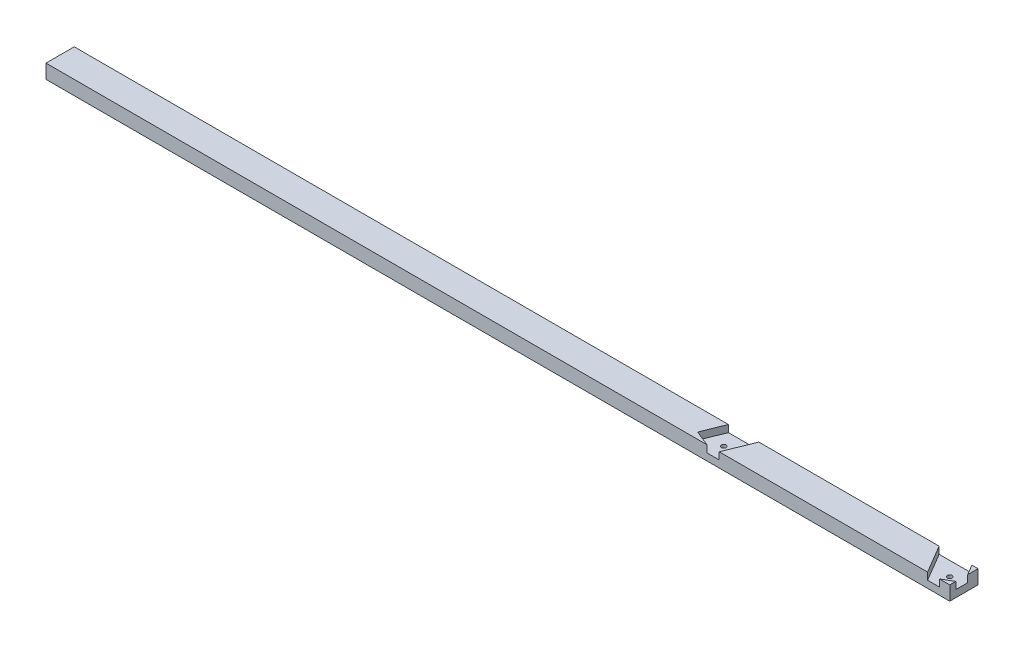
ISO-10303-21;
HEADER;
FILE_DESCRIPTION(('STEP AP214'),'2;1');
FILE_NAME('part.step','',(''),(''),'','','');
FILE_SCHEMA(('AUTOMOTIVE_DESIGN { 1 0 10303 214 1 1 1 1 }'));
ENDSEC;
DATA;
#1=APPLICATION_CONTEXT('core data for automotive mechanical design processes');
#2=APPLICATION_PROTOCOL_DEFINITION('international standard','automotive_design',2000,#1);
#3=PRODUCT_CONTEXT('',#1,'mechanical');
#4=PRODUCT('Part','Part','',(#3));
#5=PRODUCT_RELATED_PRODUCT_CATEGORY('part','',(#4));
#6=PRODUCT_DEFINITION_FORMATION('','',#4);
#7=PRODUCT_DEFINITION_CONTEXT('part definition',#1,'design');
#8=PRODUCT_DEFINITION('design','',#6,#7);
#9=PRODUCT_DEFINITION_SHAPE('','',#8);
#10=(LENGTH_UNIT() NAMED_UNIT(*) SI_UNIT(.MILLI.,.METRE.));
#11=(NAMED_UNIT(*) PLANE_ANGLE_UNIT() SI_UNIT($,.RADIAN.));
#12=(NAMED_UNIT(*) SI_UNIT($,.STERADIAN.) SOLID_ANGLE_UNIT());
#13=UNCERTAINTY_MEASURE_WITH_UNIT(LENGTH_MEASURE(1.E-05),#10,'distance_accuracy_value','');
#14=(GEOMETRIC_REPRESENTATION_CONTEXT(3) GLOBAL_UNCERTAINTY_ASSIGNED_CONTEXT((#13)) GLOBAL_UNIT_ASSIGNED_CONTEXT((#10,
#11,#12)) REPRESENTATION_CONTEXT('',''));
#15=CARTESIAN_POINT('',(0.,0.,0.));
#16=DIRECTION('',(0.,0.,1.));
#17=DIRECTION('',(1.,0.,0.));
#18=AXIS2_PLACEMENT_3D('',#15,#16,#17);
#19=CARTESIAN_POINT('',(0.,19.05,0.));
#20=DIRECTION('',(0.,-1.,0.));
#21=DIRECTION('',(0.,0.,-1.));
#22=AXIS2_PLACEMENT_3D('',#19,#20,#21);
#23=PLANE('',#22);
#24=DIRECTION('',(0.,0.,1.));
#25=VECTOR('',#24,1.);
#26=CARTESIAN_POINT('',(0.,19.05,0.));
#27=LINE('',#26,#25);
#28=CARTESIAN_POINT('',(0.,19.05,29.9175831676287));
#29=VERTEX_POINT('',#28);
#30=CARTESIAN_POINT('',(0.,19.05,38.1));
#31=VERTEX_POINT('',#30);
#32=EDGE_CURVE('E215',#29,#31,#27,.T.);
#33=ORIENTED_EDGE('',*,*,#32,.F.);
#34=DIRECTION('',(0.860808752966461,0.,-0.508928571428572));
#35=VECTOR('',#34,1.);
#36=CARTESIAN_POINT('',(13.1065990635975,19.05,22.1686810860259));
#37=LINE('',#36,#35);
#38=CARTESIAN_POINT('',(-13.8398518478814,19.05,38.1));
#39=VERTEX_POINT('',#38);
#40=EDGE_CURVE('E262',#39,#29,#37,.T.);
#41=ORIENTED_EDGE('',*,*,#40,.F.);
#42=DIRECTION('',(-1.,0.,0.));
#43=VECTOR('',#42,1.);
#44=CARTESIAN_POINT('',(0.,19.05,38.1));
#45=LINE('',#44,#43);
#46=EDGE_CURVE('E216',#31,#39,#45,.T.);
#47=ORIENTED_EDGE('',*,*,#46,.F.);
#48=EDGE_LOOP('',(#33,#41,#47));
#49=FACE_BOUND('',#48,.T.);
#50=ADVANCED_FACE('F33',(#49),#23,.F.);
#51=CARTESIAN_POINT('',(-29.9175831676286,19.05,38.1));
#52=VERTEX_POINT('',#51);
#53=CARTESIAN_POINT('',(-311.006492620075,19.05,38.1000000000001));
#54=VERTEX_POINT('',#53);
#55=EDGE_CURVE('E220',#52,#54,#45,.T.);
#56=ORIENTED_EDGE('',*,*,#55,.F.);
#57=DIRECTION('',(0.508928571428572,0.,0.860808752966461));
#58=VECTOR('',#57,1.);
#59=CARTESIAN_POINT('',(-38.8599165218942,19.05,22.9748149436995));
#60=LINE('',#59,#58);
#61=CARTESIAN_POINT('',(-52.4431191878043,19.05,0.));
#62=VERTEX_POINT('',#61);
#63=EDGE_CURVE('E260',#62,#52,#60,.T.);
#64=ORIENTED_EDGE('',*,*,#63,.F.);
#65=DIRECTION('',(1.,0.,0.));
#66=VECTOR('',#65,1.);
#67=CARTESIAN_POINT('',(-1219.2,19.05,0.));
#68=LINE('',#67,#66);
#69=CARTESIAN_POINT('',(-295.594283764165,19.05,0.));
#70=VERTEX_POINT('',#69);
#71=EDGE_CURVE('E227',#70,#62,#68,.T.);
#72=ORIENTED_EDGE('',*,*,#71,.F.);
#73=DIRECTION('',(0.375,0.,-0.927024810886958));
#74=VECTOR('',#73,1.);
#75=CARTESIAN_POINT('',(-254.02633760983,19.05,-102.758713127153));
#76=LINE('',#75,#74);
#77=EDGE_CURVE('E174',#54,#70,#76,.T.);
#78=ORIENTED_EDGE('',*,*,#77,.F.);
#79=EDGE_LOOP('',(#56,#64,#72,#78));
#80=FACE_BOUND('',#79,.T.);
#81=ADVANCED_FACE('F281',(#80),#23,.F.);
#82=CARTESIAN_POINT('',(-19.05,0.,19.05));
#83=DIRECTION('',(0.,1.,0.));
#84=DIRECTION('',(0.,0.,1.));
#85=AXIS2_PLACEMENT_3D('',#82,#83,#84);
#86=CYLINDRICAL_SURFACE('',#85,3.175);
#87=CARTESIAN_POINT('',(-19.05,0.,19.05));
#88=DIRECTION('',(0.,1.,0.));
#89=DIRECTION('',(0.,0.,1.));
#90=AXIS2_PLACEMENT_3D('',#87,#88,#89);
#91=CIRCLE('',#90,3.175);
#92=CARTESIAN_POINT('',(-19.05,0.,22.225));
#93=VERTEX_POINT('',#92);
#94=EDGE_CURVE('E209',#93,#93,#91,.T.);
#95=CARTESIAN_POINT('',(-19.05,9.525,19.05));
#96=DIRECTION('',(0.,1.,0.));
#97=DIRECTION('',(0.,0.,1.));
#98=AXIS2_PLACEMENT_3D('',#95,#96,#97);
#99=CIRCLE('',#98,3.175);
#100=CARTESIAN_POINT('',(-19.05,9.525,22.225));
#101=VERTEX_POINT('',#100);
#102=EDGE_CURVE('E157',#101,#101,#99,.F.);
#103=CARTESIAN_POINT('',(-19.05,0.,22.225));
#104=CARTESIAN_POINT('',(-19.05,0.0992187499999999,22.225));
#105=CARTESIAN_POINT('',(-19.05,0.1984375,22.225));
#106=CARTESIAN_POINT('',(-19.05,0.396875,22.225));
#107=CARTESIAN_POINT('',(-19.05,0.49609375,22.225));
#108=CARTESIAN_POINT('',(-19.05,0.69453125,22.225));
#109=CARTESIAN_POINT('',(-19.05,0.79375,22.225));
#110=CARTESIAN_POINT('',(-19.05,0.9921875,22.225));
#111=CARTESIAN_POINT('',(-19.05,1.09140625,22.225));
#112=CARTESIAN_POINT('',(-19.05,1.28984375,22.225));
#113=CARTESIAN_POINT('',(-19.05,1.3890625,22.225));
#114=CARTESIAN_POINT('',(-19.05,1.5875,22.225));
#115=CARTESIAN_POINT('',(-19.05,1.68671875,22.225));
#116=CARTESIAN_POINT('',(-19.05,1.88515625,22.225));
#117=CARTESIAN_POINT('',(-19.05,1.984375,22.225));
#118=CARTESIAN_POINT('',(-19.05,2.1828125,22.225));
#119=CARTESIAN_POINT('',(-19.05,2.28203125,22.225));
#120=CARTESIAN_POINT('',(-19.05,2.48046875,22.225));
#121=CARTESIAN_POINT('',(-19.05,2.5796875,22.225));
#122=CARTESIAN_POINT('',(-19.05,2.778125,22.225));
#123=CARTESIAN_POINT('',(-19.05,2.87734375,22.225));
#124=CARTESIAN_POINT('',(-19.05,3.07578125,22.225));
#125=CARTESIAN_POINT('',(-19.05,3.175,22.225));
#126=CARTESIAN_POINT('',(-19.05,3.3734375,22.225));
#127=CARTESIAN_POINT('',(-19.05,3.47265625,22.225));
#128=CARTESIAN_POINT('',(-19.05,3.67109375,22.225));
#129=CARTESIAN_POINT('',(-19.05,3.7703125,22.225));
#130=CARTESIAN_POINT('',(-19.05,3.96875,22.225));
#131=CARTESIAN_POINT('',(-19.05,4.06796875,22.225));
#132=CARTESIAN_POINT('',(-19.05,4.26640625,22.225));
#133=CARTESIAN_POINT('',(-19.05,4.365625,22.225));
#134=CARTESIAN_POINT('',(-19.05,4.5640625,22.225));
#135=CARTESIAN_POINT('',(-19.05,4.66328125,22.225));
#136=CARTESIAN_POINT('',(-19.05,4.86171875,22.225));
#137=CARTESIAN_POINT('',(-19.05,4.9609375,22.225));
#138=CARTESIAN_POINT('',(-19.05,5.159375,22.225));
#139=CARTESIAN_POINT('',(-19.05,5.25859375,22.225));
#140=CARTESIAN_POINT('',(-19.05,5.45703125,22.225));
#141=CARTESIAN_POINT('',(-19.05,5.55625,22.225));
#142=CARTESIAN_POINT('',(-19.05,5.7546875,22.225));
#143=CARTESIAN_POINT('',(-19.05,5.85390625,22.225));
#144=CARTESIAN_POINT('',(-19.05,6.05234375,22.225));
#145=CARTESIAN_POINT('',(-19.05,6.1515625,22.225));
#146=CARTESIAN_POINT('',(-19.05,6.35,22.225));
#147=CARTESIAN_POINT('',(-19.05,6.44921875,22.225));
#148=CARTESIAN_POINT('',(-19.05,6.64765625,22.225));
#149=CARTESIAN_POINT('',(-19.05,6.746875,22.225));
#150=CARTESIAN_POINT('',(-19.05,6.9453125,22.225));
#151=CARTESIAN_POINT('',(-19.05,7.04453125,22.225));
#152=CARTESIAN_POINT('',(-19.05,7.24296875,22.225));
#153=CARTESIAN_POINT('',(-19.05,7.3421875,22.225));
#154=CARTESIAN_POINT('',(-19.05,7.540625,22.225));
#155=CARTESIAN_POINT('',(-19.05,7.63984375,22.225));
#156=CARTESIAN_POINT('',(-19.05,7.83828125,22.225));
#157=CARTESIAN_POINT('',(-19.05,7.9375,22.225));
#158=CARTESIAN_POINT('',(-19.05,8.1359375,22.225));
#159=CARTESIAN_POINT('',(-19.05,8.23515625,22.225));
#160=CARTESIAN_POINT('',(-19.05,8.43359375,22.225));
#161=CARTESIAN_POINT('',(-19.05,8.5328125,22.225));
#162=CARTESIAN_POINT('',(-19.05,8.73125,22.225));
#163=CARTESIAN_POINT('',(-19.05,8.83046875,22.225));
#164=CARTESIAN_POINT('',(-19.05,9.02890625,22.225));
#165=CARTESIAN_POINT('',(-19.05,9.128125,22.225));
#166=CARTESIAN_POINT('',(-19.05,9.3265625,22.225));
#167=CARTESIAN_POINT('',(-19.05,9.42578125,22.225));
#168=CARTESIAN_POINT('',(-19.05,9.525,22.225));
#169=B_SPLINE_CURVE_WITH_KNOTS('',3,(#103,#104,#105,#106,#107,#108,#109,#110,#111,#112,#113,
#114,#115,#116,#117,#118,#119,#120,#121,#122,#123,#124,#125,#126,#127,#128,#129,#130,#131,#132,
#133,#134,#135,#136,#137,#138,#139,#140,#141,#142,#143,#144,#145,#146,#147,#148,#149,#150,#151,
#152,#153,#154,#155,#156,#157,#158,#159,#160,#161,#162,#163,#164,#165,#166,#167,#168),
.UNSPECIFIED.,.F.,.F.,(4,2,2,2,2,2,2,2,2,2,2,2,2,2,2,2,2,2,2,2,2,2,2,2,2,2,2,2,2,2,2,2,4),(0.,
0.29765625,0.5953125,0.89296875,1.190625,1.48828125,1.7859375,2.08359375,2.38125,2.67890625,
2.9765625,3.27421875,3.571875,3.86953125,4.1671875,4.46484375,4.7625,5.06015625,5.3578125,
5.65546875,5.953125,6.25078125,6.5484375,6.84609375,7.14375,7.44140625,7.7390625,8.03671875,
8.334375,8.63203125,8.9296875,9.22734375,9.525),.UNSPECIFIED.);
#170=EDGE_CURVE('BSEAM323',#93,#101,#169,.T.);
#171=ORIENTED_EDGE('',*,*,#94,.F.);
#172=ORIENTED_EDGE('',*,*,#102,.F.);
#173=ORIENTED_EDGE('',*,*,#170,.T.);
#174=ORIENTED_EDGE('',*,*,#170,.F.);
#175=EDGE_LOOP('',(#171,#173,#172,#174));
#176=FACE_BOUND('',#175,.T.);
#177=ADVANCED_FACE('F323',(#176),#86,.F.);
#178=CARTESIAN_POINT('',(-1219.2,19.05,0.));
#179=DIRECTION('',(0.,0.,-1.));
#180=DIRECTION('',(-1.,0.,0.));
#181=AXIS2_PLACEMENT_3D('',#178,#179,#180);
#182=PLANE('',#181);
#183=DIRECTION('',(0.,1.,0.));
#184=VECTOR('',#183,1.);
#185=CARTESIAN_POINT('',(-52.4431191878043,9.525,0.));
#186=LINE('',#185,#184);
#187=CARTESIAN_POINT('',(-52.4431191878043,9.525,0.));
#188=VERTEX_POINT('',#187);
#189=EDGE_CURVE('E164',#188,#62,#186,.T.);
#190=ORIENTED_EDGE('',*,*,#189,.F.);
#191=DIRECTION('',(-1.,0.,0.));
#192=VECTOR('',#191,1.);
#193=CARTESIAN_POINT('',(0.,9.525,0.));
#194=LINE('',#193,#192);
#195=CARTESIAN_POINT('',(-8.1824168323713,9.525,0.));
#196=VERTEX_POINT('',#195);
#197=EDGE_CURVE('E147',#196,#188,#194,.T.);
#198=ORIENTED_EDGE('',*,*,#197,.F.);
#199=DIRECTION('',(0.,1.,0.));
#200=VECTOR('',#199,1.);
#201=CARTESIAN_POINT('',(-8.1824168323713,9.525,0.));
#202=LINE('',#201,#200);
#203=CARTESIAN_POINT('',(-8.1824168323713,19.05,0.));
#204=VERTEX_POINT('',#203);
#205=EDGE_CURVE('E143',#196,#204,#202,.T.);
#206=ORIENTED_EDGE('',*,*,#205,.T.);
#207=CARTESIAN_POINT('',(0.,19.05,0.));
#208=VERTEX_POINT('',#207);
#209=EDGE_CURVE('E223',#204,#208,#68,.T.);
#210=ORIENTED_EDGE('',*,*,#209,.T.);
#211=DIRECTION('',(0.,-1.,0.));
#212=VECTOR('',#211,1.);
#213=CARTESIAN_POINT('',(0.,19.05,0.));
#214=LINE('',#213,#212);
#215=CARTESIAN_POINT('',(0.,0.,0.));
#216=VERTEX_POINT('',#215);
#217=EDGE_CURVE('E11',#208,#216,#214,.T.);
#218=ORIENTED_EDGE('',*,*,#217,.T.);
#219=DIRECTION('',(1.,0.,0.));
#220=VECTOR('',#219,1.);
#221=CARTESIAN_POINT('',(-1219.2,0.,0.));
#222=LINE('',#221,#220);
#223=CARTESIAN_POINT('',(-1219.2,0.,0.));
#224=VERTEX_POINT('',#223);
#225=EDGE_CURVE('E236',#224,#216,#222,.T.);
#226=ORIENTED_EDGE('',*,*,#225,.F.);
#227=DIRECTION('',(0.,-1.,0.));
#228=VECTOR('',#227,1.);
#229=CARTESIAN_POINT('',(-1219.2,19.05,0.));
#230=LINE('',#229,#228);
#231=CARTESIAN_POINT('',(-1219.2,19.05,0.));
#232=VERTEX_POINT('',#231);
#233=EDGE_CURVE('E42',#232,#224,#230,.T.);
#234=ORIENTED_EDGE('',*,*,#233,.F.);
#235=CARTESIAN_POINT('',(-336.693507379925,19.05,0.));
#236=VERTEX_POINT('',#235);
#237=EDGE_CURVE('E224',#232,#236,#68,.T.);
#238=ORIENTED_EDGE('',*,*,#237,.T.);
#239=DIRECTION('',(0.,1.,0.));
#240=VECTOR('',#239,1.);
#241=CARTESIAN_POINT('',(-336.693507379925,9.525,0.));
#242=LINE('',#241,#240);
#243=CARTESIAN_POINT('',(-336.693507379925,9.525,0.));
#244=VERTEX_POINT('',#243);
#245=EDGE_CURVE('E194',#244,#236,#242,.T.);
#246=ORIENTED_EDGE('',*,*,#245,.F.);
#247=DIRECTION('',(-1.,0.,0.));
#248=VECTOR('',#247,1.);
#249=CARTESIAN_POINT('',(0.,9.525,0.));
#250=LINE('',#249,#248);
#251=CARTESIAN_POINT('',(-295.594283764165,9.525,0.));
#252=VERTEX_POINT('',#251);
#253=EDGE_CURVE('E185',#252,#244,#250,.T.);
#254=ORIENTED_EDGE('',*,*,#253,.F.);
#255=DIRECTION('',(0.,1.,0.));
#256=VECTOR('',#255,1.);
#257=CARTESIAN_POINT('',(-295.594283764165,9.525,0.));
#258=LINE('',#257,#256);
#259=EDGE_CURVE('E197',#252,#70,#258,.T.);
#260=ORIENTED_EDGE('',*,*,#259,.T.);
#261=ORIENTED_EDGE('',*,*,#71,.T.);
#262=EDGE_LOOP('',(#190,#198,#206,#210,#218,#226,#234,#238,#246,#254,#260,#261));
#263=FACE_BOUND('',#262,.T.);
#264=ADVANCED_FACE('F255',(#263),#182,.T.);
#265=DIRECTION('',(0.375,0.,-0.927024810886958));
#266=VECTOR('',#265,1.);
#267=CARTESIAN_POINT('',(-289.345982904623,19.05,-117.046213127153));
#268=LINE('',#267,#266);
#269=CARTESIAN_POINT('',(-348.653572647397,19.05,29.5660726473966));
#270=VERTEX_POINT('',#269);
#271=EDGE_CURVE('E58',#270,#236,#268,.T.);
#272=ORIENTED_EDGE('',*,*,#271,.T.);
#273=ORIENTED_EDGE('',*,*,#237,.F.);
#274=DIRECTION('',(0.,0.,-1.));
#275=VECTOR('',#274,1.);
#276=CARTESIAN_POINT('',(-1219.2,19.05,38.1000000000002));
#277=LINE('',#276,#275);
#278=CARTESIAN_POINT('',(-1219.2,19.05,38.1000000000002));
#279=VERTEX_POINT('',#278);
#280=EDGE_CURVE('E219',#279,#232,#277,.T.);
#281=ORIENTED_EDGE('',*,*,#280,.F.);
#282=CARTESIAN_POINT('',(-327.557139606942,19.05,38.1000000000001));
#283=VERTEX_POINT('',#282);
#284=EDGE_CURVE('E214',#283,#279,#45,.T.);
#285=ORIENTED_EDGE('',*,*,#284,.F.);
#286=DIRECTION('',(0.927024810886958,0.,0.375));
#287=VECTOR('',#286,1.);
#288=CARTESIAN_POINT('',(-59.3075897427736,19.05,146.612285774549));
#289=LINE('',#288,#287);
#290=EDGE_CURVE('E190',#270,#283,#289,.T.);
#291=ORIENTED_EDGE('',*,*,#290,.F.);
#292=EDGE_LOOP('',(#272,#273,#281,#285,#291));
#293=FACE_BOUND('',#292,.T.);
#294=ADVANCED_FACE('F301',(#293),#23,.F.);
#295=CARTESIAN_POINT('',(-323.85,0.,19.05));
#296=DIRECTION('',(0.,1.,0.));
#297=DIRECTION('',(0.,0.,1.));
#298=AXIS2_PLACEMENT_3D('',#295,#296,#297);
#299=CYLINDRICAL_SURFACE('',#298,3.17499999999997);
#300=CARTESIAN_POINT('',(-323.85,0.,19.05));
#301=DIRECTION('',(0.,1.,0.));
#302=DIRECTION('',(0.,0.,1.));
#303=AXIS2_PLACEMENT_3D('',#300,#301,#302);
#304=CIRCLE('',#303,3.17499999999997);
#305=CARTESIAN_POINT('',(-323.85,0.,22.225));
#306=VERTEX_POINT('',#305);
#307=EDGE_CURVE('E196',#306,#306,#304,.T.);
#308=CARTESIAN_POINT('',(-323.85,9.525,19.05));
#309=DIRECTION('',(0.,1.,0.));
#310=DIRECTION('',(0.,0.,1.));
#311=AXIS2_PLACEMENT_3D('',#308,#309,#310);
#312=CIRCLE('',#311,3.17499999999997);
#313=CARTESIAN_POINT('',(-323.85,9.525,22.225));
#314=VERTEX_POINT('',#313);
#315=EDGE_CURVE('E170',#314,#314,#312,.F.);
#316=CARTESIAN_POINT('',(-323.85,0.,22.225));
#317=CARTESIAN_POINT('',(-323.85,0.0992187499999999,22.225));
#318=CARTESIAN_POINT('',(-323.85,0.1984375,22.225));
#319=CARTESIAN_POINT('',(-323.85,0.396875,22.225));
#320=CARTESIAN_POINT('',(-323.85,0.49609375,22.225));
#321=CARTESIAN_POINT('',(-323.85,0.69453125,22.225));
#322=CARTESIAN_POINT('',(-323.85,0.79375,22.225));
#323=CARTESIAN_POINT('',(-323.85,0.9921875,22.225));
#324=CARTESIAN_POINT('',(-323.85,1.09140625,22.225));
#325=CARTESIAN_POINT('',(-323.85,1.28984375,22.225));
#326=CARTESIAN_POINT('',(-323.85,1.3890625,22.225));
#327=CARTESIAN_POINT('',(-323.85,1.5875,22.225));
#328=CARTESIAN_POINT('',(-323.85,1.68671875,22.225));
#329=CARTESIAN_POINT('',(-323.85,1.88515625,22.225));
#330=CARTESIAN_POINT('',(-323.85,1.984375,22.225));
#331=CARTESIAN_POINT('',(-323.85,2.1828125,22.225));
#332=CARTESIAN_POINT('',(-323.85,2.28203125,22.225));
#333=CARTESIAN_POINT('',(-323.85,2.48046875,22.225));
#334=CARTESIAN_POINT('',(-323.85,2.5796875,22.225));
#335=CARTESIAN_POINT('',(-323.85,2.778125,22.225));
#336=CARTESIAN_POINT('',(-323.85,2.87734375,22.225));
#337=CARTESIAN_POINT('',(-323.85,3.07578125,22.225));
#338=CARTESIAN_POINT('',(-323.85,3.175,22.225));
#339=CARTESIAN_POINT('',(-323.85,3.3734375,22.225));
#340=CARTESIAN_POINT('',(-323.85,3.47265625,22.225));
#341=CARTESIAN_POINT('',(-323.85,3.67109375,22.225));
#342=CARTESIAN_POINT('',(-323.85,3.7703125,22.225));
#343=CARTESIAN_POINT('',(-323.85,3.96875,22.225));
#344=CARTESIAN_POINT('',(-323.85,4.06796875,22.225));
#345=CARTESIAN_POINT('',(-323.85,4.26640625,22.225));
#346=CARTESIAN_POINT('',(-323.85,4.365625,22.225));
#347=CARTESIAN_POINT('',(-323.85,4.5640625,22.225));
#348=CARTESIAN_POINT('',(-323.85,4.66328125,22.225));
#349=CARTESIAN_POINT('',(-323.85,4.86171875,22.225));
#350=CARTESIAN_POINT('',(-323.85,4.9609375,22.225));
#351=CARTESIAN_POINT('',(-323.85,5.159375,22.225));
#352=CARTESIAN_POINT('',(-323.85,5.25859375,22.225));
#353=CARTESIAN_POINT('',(-323.85,5.45703125,22.225));
#354=CARTESIAN_POINT('',(-323.85,5.55625,22.225));
#355=CARTESIAN_POINT('',(-323.85,5.7546875,22.225));
#356=CARTESIAN_POINT('',(-323.85,5.85390625,22.225));
#357=CARTESIAN_POINT('',(-323.85,6.05234375,22.225));
#358=CARTESIAN_POINT('',(-323.85,6.1515625,22.225));
#359=CARTESIAN_POINT('',(-323.85,6.35,22.225));
#360=CARTESIAN_POINT('',(-323.85,6.44921875,22.225));
#361=CARTESIAN_POINT('',(-323.85,6.64765625,22.225));
#362=CARTESIAN_POINT('',(-323.85,6.746875,22.225));
#363=CARTESIAN_POINT('',(-323.85,6.9453125,22.225));
#364=CARTESIAN_POINT('',(-323.85,7.04453125,22.225));
#365=CARTESIAN_POINT('',(-323.85,7.24296875,22.225));
#366=CARTESIAN_POINT('',(-323.85,7.3421875,22.225));
#367=CARTESIAN_POINT('',(-323.85,7.540625,22.225));
#368=CARTESIAN_POINT('',(-323.85,7.63984375,22.225));
#369=CARTESIAN_POINT('',(-323.85,7.83828125,22.225));
#370=CARTESIAN_POINT('',(-323.85,7.9375,22.225));
#371=CARTESIAN_POINT('',(-323.85,8.1359375,22.225));
#372=CARTESIAN_POINT('',(-323.85,8.23515625,22.225));
#373=CARTESIAN_POINT('',(-323.85,8.43359375,22.225));
#374=CARTESIAN_POINT('',(-323.85,8.5328125,22.225));
#375=CARTESIAN_POINT('',(-323.85,8.73125,22.225));
#376=CARTESIAN_POINT('',(-323.85,8.83046875,22.225));
#377=CARTESIAN_POINT('',(-323.85,9.02890625,22.225));
#378=CARTESIAN_POINT('',(-323.85,9.128125,22.225));
#379=CARTESIAN_POINT('',(-323.85,9.3265625,22.225));
#380=CARTESIAN_POINT('',(-323.85,9.42578125,22.225));
#381=CARTESIAN_POINT('',(-323.85,9.525,22.225));
#382=B_SPLINE_CURVE_WITH_KNOTS('',3,(#316,#317,#318,#319,#320,#321,#322,#323,#324,#325,#326,
#327,#328,#329,#330,#331,#332,#333,#334,#335,#336,#337,#338,#339,#340,#341,#342,#343,#344,#345,
#346,#347,#348,#349,#350,#351,#352,#353,#354,#355,#356,#357,#358,#359,#360,#361,#362,#363,#364,
#365,#366,#367,#368,#369,#370,#371,#372,#373,#374,#375,#376,#377,#378,#379,#380,#381),
.UNSPECIFIED.,.F.,.F.,(4,2,2,2,2,2,2,2,2,2,2,2,2,2,2,2,2,2,2,2,2,2,2,2,2,2,2,2,2,2,2,2,4),(0.,
0.29765625,0.5953125,0.89296875,1.190625,1.48828125,1.7859375,2.08359375,2.38125,2.67890625,
2.9765625,3.27421875,3.571875,3.86953125,4.1671875,4.46484375,4.7625,5.06015625,5.3578125,
5.65546875,5.953125,6.25078125,6.5484375,6.84609375,7.14375,7.44140625,7.7390625,8.03671875,
8.334375,8.63203125,8.9296875,9.22734375,9.525),.UNSPECIFIED.);
#383=EDGE_CURVE('BSEAM333',#306,#314,#382,.T.);
#384=ORIENTED_EDGE('',*,*,#307,.F.);
#385=ORIENTED_EDGE('',*,*,#315,.F.);
#386=ORIENTED_EDGE('',*,*,#383,.T.);
#387=ORIENTED_EDGE('',*,*,#383,.F.);
#388=EDGE_LOOP('',(#384,#386,#385,#387));
#389=FACE_BOUND('',#388,.T.);
#390=ADVANCED_FACE('F333',(#389),#299,.F.);
#391=CARTESIAN_POINT('',(0.,19.05,0.));
#392=DIRECTION('',(1.,0.,0.));
#393=DIRECTION('',(0.,0.,-1.));
#394=AXIS2_PLACEMENT_3D('',#391,#392,#393);
#395=PLANE('',#394);
#396=DIRECTION('',(0.,1.,0.));
#397=VECTOR('',#396,1.);
#398=CARTESIAN_POINT('',(0.,9.525,29.9175831676287));
#399=LINE('',#398,#397);
#400=CARTESIAN_POINT('',(0.,9.525,29.9175831676287));
#401=VERTEX_POINT('',#400);
#402=EDGE_CURVE('E191',#401,#29,#399,.T.);
#403=ORIENTED_EDGE('',*,*,#402,.T.);
#404=ORIENTED_EDGE('',*,*,#32,.T.);
#405=DIRECTION('',(0.,-1.,0.));
#406=VECTOR('',#405,1.);
#407=CARTESIAN_POINT('',(0.,19.05,38.1));
#408=LINE('',#407,#406);
#409=CARTESIAN_POINT('',(0.,0.,38.1));
#410=VERTEX_POINT('',#409);
#411=EDGE_CURVE('E37',#31,#410,#408,.T.);
#412=ORIENTED_EDGE('',*,*,#411,.T.);
#413=DIRECTION('',(0.,0.,1.));
#414=VECTOR('',#413,1.);
#415=CARTESIAN_POINT('',(0.,0.,0.));
#416=LINE('',#415,#414);
#417=EDGE_CURVE('E212',#216,#410,#416,.T.);
#418=ORIENTED_EDGE('',*,*,#417,.F.);
#419=ORIENTED_EDGE('',*,*,#217,.F.);
#420=CARTESIAN_POINT('',(0.,19.05,13.8398518478813));
#421=VERTEX_POINT('',#420);
#422=EDGE_CURVE('E162',#208,#421,#27,.T.);
#423=ORIENTED_EDGE('',*,*,#422,.T.);
#424=DIRECTION('',(0.,1.,0.));
#425=VECTOR('',#424,1.);
#426=CARTESIAN_POINT('',(0.,9.525,13.8398518478813));
#427=LINE('',#426,#425);
#428=CARTESIAN_POINT('',(0.,9.525,13.8398518478813));
#429=VERTEX_POINT('',#428);
#430=EDGE_CURVE('E50',#429,#421,#427,.T.);
#431=ORIENTED_EDGE('',*,*,#430,.F.);
#432=DIRECTION('',(0.,0.,-1.));
#433=VECTOR('',#432,1.);
#434=CARTESIAN_POINT('',(0.,9.525,0.));
#435=LINE('',#434,#433);
#436=EDGE_CURVE('E148',#401,#429,#435,.T.);
#437=ORIENTED_EDGE('',*,*,#436,.F.);
#438=EDGE_LOOP('',(#403,#404,#412,#418,#419,#423,#431,#437));
#439=FACE_BOUND('',#438,.T.);
#440=ADVANCED_FACE('F35',(#439),#395,.T.);
#441=CARTESIAN_POINT('',(-1219.2,19.05,38.1000000000002));
#442=DIRECTION('',(-1.,0.,0.));
#443=DIRECTION('',(0.,0.,1.));
#444=AXIS2_PLACEMENT_3D('',#441,#442,#443);
#445=PLANE('',#444);
#446=DIRECTION('',(0.,0.,-1.));
#447=VECTOR('',#446,1.);
#448=CARTESIAN_POINT('',(-1219.2,0.,38.1000000000002));
#449=LINE('',#448,#447);
#450=CARTESIAN_POINT('',(-1219.2,0.,38.1000000000002));
#451=VERTEX_POINT('',#450);
#452=EDGE_CURVE('E233',#451,#224,#449,.T.);
#453=ORIENTED_EDGE('',*,*,#452,.F.);
#454=DIRECTION('',(0.,-1.,0.));
#455=VECTOR('',#454,1.);
#456=CARTESIAN_POINT('',(-1219.2,19.05,38.1000000000002));
#457=LINE('',#456,#455);
#458=EDGE_CURVE('E239',#279,#451,#457,.T.);
#459=ORIENTED_EDGE('',*,*,#458,.F.);
#460=ORIENTED_EDGE('',*,*,#280,.T.);
#461=ORIENTED_EDGE('',*,*,#233,.T.);
#462=EDGE_LOOP('',(#453,#459,#460,#461));
#463=FACE_BOUND('',#462,.T.);
#464=ADVANCED_FACE('F299',(#463),#445,.T.);
#465=CARTESIAN_POINT('',(0.,19.05,38.1));
#466=DIRECTION('',(0.,0.,1.));
#467=DIRECTION('',(1.,0.,0.));
#468=AXIS2_PLACEMENT_3D('',#465,#466,#467);
#469=PLANE('',#468);
#470=DIRECTION('',(0.,1.,0.));
#471=VECTOR('',#470,1.);
#472=CARTESIAN_POINT('',(-13.8398518478814,9.525,38.1));
#473=LINE('',#472,#471);
#474=CARTESIAN_POINT('',(-13.8398518478814,9.525,38.1));
#475=VERTEX_POINT('',#474);
#476=EDGE_CURVE('E268',#475,#39,#473,.T.);
#477=ORIENTED_EDGE('',*,*,#476,.F.);
#478=DIRECTION('',(1.,0.,0.));
#479=VECTOR('',#478,1.);
#480=CARTESIAN_POINT('',(0.,9.525,38.1));
#481=LINE('',#480,#479);
#482=CARTESIAN_POINT('',(-29.9175831676286,9.525,38.1));
#483=VERTEX_POINT('',#482);
#484=EDGE_CURVE('E166',#483,#475,#481,.T.);
#485=ORIENTED_EDGE('',*,*,#484,.F.);
#486=DIRECTION('',(0.,1.,0.));
#487=VECTOR('',#486,1.);
#488=CARTESIAN_POINT('',(-29.9175831676286,9.525,38.1));
#489=LINE('',#488,#487);
#490=EDGE_CURVE('E270',#483,#52,#489,.T.);
#491=ORIENTED_EDGE('',*,*,#490,.T.);
#492=ORIENTED_EDGE('',*,*,#55,.T.);
#493=DIRECTION('',(0.,1.,0.));
#494=VECTOR('',#493,1.);
#495=CARTESIAN_POINT('',(-311.006492620075,9.525,38.1000000000001));
#496=LINE('',#495,#494);
#497=CARTESIAN_POINT('',(-311.006492620075,9.525,38.1000000000001));
#498=VERTEX_POINT('',#497);
#499=EDGE_CURVE('E200',#498,#54,#496,.T.);
#500=ORIENTED_EDGE('',*,*,#499,.F.);
#501=DIRECTION('',(1.,0.,0.));
#502=VECTOR('',#501,1.);
#503=CARTESIAN_POINT('',(0.,9.525,38.1));
#504=LINE('',#503,#502);
#505=CARTESIAN_POINT('',(-327.557139606942,9.525,38.1000000000001));
#506=VERTEX_POINT('',#505);
#507=EDGE_CURVE('E179',#506,#498,#504,.T.);
#508=ORIENTED_EDGE('',*,*,#507,.F.);
#509=DIRECTION('',(0.,1.,0.));
#510=VECTOR('',#509,1.);
#511=CARTESIAN_POINT('',(-327.557139606942,9.525,38.1000000000001));
#512=LINE('',#511,#510);
#513=EDGE_CURVE('E203',#506,#283,#512,.T.);
#514=ORIENTED_EDGE('',*,*,#513,.T.);
#515=ORIENTED_EDGE('',*,*,#284,.T.);
#516=ORIENTED_EDGE('',*,*,#458,.T.);
#517=DIRECTION('',(-1.,0.,0.));
#518=VECTOR('',#517,1.);
#519=CARTESIAN_POINT('',(0.,0.,38.1));
#520=LINE('',#519,#518);
#521=EDGE_CURVE('E230',#410,#451,#520,.T.);
#522=ORIENTED_EDGE('',*,*,#521,.F.);
#523=ORIENTED_EDGE('',*,*,#411,.F.);
#524=ORIENTED_EDGE('',*,*,#46,.T.);
#525=EDGE_LOOP('',(#477,#485,#491,#492,#500,#508,#514,#515,#516,#522,#523,#524));
#526=FACE_BOUND('',#525,.T.);
#527=ADVANCED_FACE('F249',(#526),#469,.T.);
#528=ORIENTED_EDGE('',*,*,#209,.F.);
#529=DIRECTION('',(-0.508928571428572,0.,-0.860808752966461));
#530=VECTOR('',#529,1.);
#531=CARTESIAN_POINT('',(-6.06310303387208,19.05,3.58463637227093));
#532=LINE('',#531,#530);
#533=EDGE_CURVE('E259',#421,#204,#532,.T.);
#534=ORIENTED_EDGE('',*,*,#533,.F.);
#535=ORIENTED_EDGE('',*,*,#422,.F.);
#536=EDGE_LOOP('',(#528,#534,#535));
#537=FACE_BOUND('',#536,.T.);
#538=ADVANCED_FACE('F258',(#537),#23,.F.);
#539=CARTESIAN_POINT('',(0.,0.,0.));
#540=DIRECTION('',(0.,-1.,0.));
#541=DIRECTION('',(0.,0.,-1.));
#542=AXIS2_PLACEMENT_3D('',#539,#540,#541);
#543=PLANE('',#542);
#544=ORIENTED_EDGE('',*,*,#307,.T.);
#545=EDGE_LOOP('',(#544));
#546=FACE_BOUND('',#545,.T.);
#547=ORIENTED_EDGE('',*,*,#94,.T.);
#548=EDGE_LOOP('',(#547));
#549=FACE_BOUND('',#548,.T.);
#550=ORIENTED_EDGE('',*,*,#417,.T.);
#551=ORIENTED_EDGE('',*,*,#521,.T.);
#552=ORIENTED_EDGE('',*,*,#452,.T.);
#553=ORIENTED_EDGE('',*,*,#225,.T.);
#554=EDGE_LOOP('',(#550,#551,#552,#553));
#555=FACE_BOUND('',#554,.T.);
#556=ADVANCED_FACE('F251',(#546,#549,#555),#543,.T.);
#557=CARTESIAN_POINT('',(-289.345982904623,9.525,-117.046213127153));
#558=DIRECTION('',(0.927024810886958,0.,0.375));
#559=DIRECTION('',(0.375,0.,-0.927024810886958));
#560=AXIS2_PLACEMENT_3D('',#557,#558,#559);
#561=PLANE('',#560);
#562=ORIENTED_EDGE('',*,*,#271,.F.);
#563=DIRECTION('',(0.,1.,0.));
#564=VECTOR('',#563,1.);
#565=CARTESIAN_POINT('',(-348.653572647397,9.525,29.5660726473966));
#566=LINE('',#565,#564);
#567=CARTESIAN_POINT('',(-348.653572647397,9.525,29.5660726473966));
#568=VERTEX_POINT('',#567);
#569=EDGE_CURVE('E188',#568,#270,#566,.T.);
#570=ORIENTED_EDGE('',*,*,#569,.F.);
#571=DIRECTION('',(0.375,0.,-0.927024810886958));
#572=VECTOR('',#571,1.);
#573=CARTESIAN_POINT('',(-289.345982904623,9.525,-117.046213127153));
#574=LINE('',#573,#572);
#575=EDGE_CURVE('E173',#568,#244,#574,.T.);
#576=ORIENTED_EDGE('',*,*,#575,.T.);
#577=ORIENTED_EDGE('',*,*,#245,.T.);
#578=EDGE_LOOP('',(#562,#570,#576,#577));
#579=FACE_BOUND('',#578,.T.);
#580=ADVANCED_FACE('F302',(#579),#561,.T.);
#581=CARTESIAN_POINT('',(-254.02633760983,9.525,-102.758713127153));
#582=DIRECTION('',(0.927024810886958,0.,0.375));
#583=DIRECTION('',(0.375,0.,-0.927024810886958));
#584=AXIS2_PLACEMENT_3D('',#581,#582,#583);
#585=PLANE('',#584);
#586=ORIENTED_EDGE('',*,*,#77,.T.);
#587=ORIENTED_EDGE('',*,*,#259,.F.);
#588=DIRECTION('',(0.375,0.,-0.927024810886958));
#589=VECTOR('',#588,1.);
#590=CARTESIAN_POINT('',(-254.02633760983,9.525,-102.758713127153));
#591=LINE('',#590,#589);
#592=EDGE_CURVE('E182',#498,#252,#591,.T.);
#593=ORIENTED_EDGE('',*,*,#592,.F.);
#594=ORIENTED_EDGE('',*,*,#499,.T.);
#595=EDGE_LOOP('',(#586,#587,#593,#594));
#596=FACE_BOUND('',#595,.T.);
#597=ADVANCED_FACE('F286',(#596),#585,.F.);
#598=CARTESIAN_POINT('',(-59.3075897427736,9.525,146.612285774549));
#599=DIRECTION('',(-0.375,0.,0.927024810886958));
#600=DIRECTION('',(0.927024810886958,0.,0.375));
#601=AXIS2_PLACEMENT_3D('',#598,#599,#600);
#602=PLANE('',#601);
#603=ORIENTED_EDGE('',*,*,#290,.T.);
#604=ORIENTED_EDGE('',*,*,#513,.F.);
#605=DIRECTION('',(0.927024810886958,0.,0.375));
#606=VECTOR('',#605,1.);
#607=CARTESIAN_POINT('',(-59.3075897427736,9.525,146.612285774549));
#608=LINE('',#607,#606);
#609=EDGE_CURVE('E176',#568,#506,#608,.T.);
#610=ORIENTED_EDGE('',*,*,#609,.F.);
#611=ORIENTED_EDGE('',*,*,#569,.T.);
#612=EDGE_LOOP('',(#603,#604,#610,#611));
#613=FACE_BOUND('',#612,.T.);
#614=ADVANCED_FACE('F304',(#613),#602,.F.);
#615=CARTESIAN_POINT('',(0.,9.525,0.));
#616=DIRECTION('',(0.,1.,0.));
#617=DIRECTION('',(0.,0.,1.));
#618=AXIS2_PLACEMENT_3D('',#615,#616,#617);
#619=PLANE('',#618);
#620=ORIENTED_EDGE('',*,*,#315,.T.);
#621=EDGE_LOOP('',(#620));
#622=FACE_BOUND('',#621,.T.);
#623=ORIENTED_EDGE('',*,*,#575,.F.);
#624=ORIENTED_EDGE('',*,*,#609,.T.);
#625=ORIENTED_EDGE('',*,*,#507,.T.);
#626=ORIENTED_EDGE('',*,*,#592,.T.);
#627=ORIENTED_EDGE('',*,*,#253,.T.);
#628=EDGE_LOOP('',(#623,#624,#625,#626,#627));
#629=FACE_BOUND('',#628,.T.);
#630=ADVANCED_FACE('F289',(#622,#629),#619,.T.);
#631=CARTESIAN_POINT('',(13.1065990635975,9.525,22.1686810860259));
#632=DIRECTION('',(0.508928571428572,0.,0.860808752966461));
#633=DIRECTION('',(0.860808752966461,0.,-0.508928571428572));
#634=AXIS2_PLACEMENT_3D('',#631,#632,#633);
#635=PLANE('',#634);
#636=ORIENTED_EDGE('',*,*,#40,.T.);
#637=ORIENTED_EDGE('',*,*,#402,.F.);
#638=DIRECTION('',(0.860808752966461,0.,-0.508928571428572));
#639=VECTOR('',#638,1.);
#640=CARTESIAN_POINT('',(13.1065990635975,9.525,22.1686810860259));
#641=LINE('',#640,#639);
#642=EDGE_CURVE('E154',#475,#401,#641,.T.);
#643=ORIENTED_EDGE('',*,*,#642,.F.);
#644=ORIENTED_EDGE('',*,*,#476,.T.);
#645=EDGE_LOOP('',(#636,#637,#643,#644));
#646=FACE_BOUND('',#645,.T.);
#647=ADVANCED_FACE('F311',(#646),#635,.F.);
#648=CARTESIAN_POINT('',(-38.8599165218942,9.525,22.9748149436995));
#649=DIRECTION('',(-0.860808752966461,0.,0.508928571428572));
#650=DIRECTION('',(0.508928571428572,0.,0.860808752966461));
#651=AXIS2_PLACEMENT_3D('',#648,#649,#650);
#652=PLANE('',#651);
#653=ORIENTED_EDGE('',*,*,#63,.T.);
#654=ORIENTED_EDGE('',*,*,#490,.F.);
#655=DIRECTION('',(0.508928571428572,0.,0.860808752966461));
#656=VECTOR('',#655,1.);
#657=CARTESIAN_POINT('',(-38.8599165218942,9.525,22.9748149436995));
#658=LINE('',#657,#656);
#659=EDGE_CURVE('E276',#188,#483,#658,.T.);
#660=ORIENTED_EDGE('',*,*,#659,.F.);
#661=ORIENTED_EDGE('',*,*,#189,.T.);
#662=EDGE_LOOP('',(#653,#654,#660,#661));
#663=FACE_BOUND('',#662,.T.);
#664=ADVANCED_FACE('F274',(#663),#652,.F.);
#665=CARTESIAN_POINT('',(-6.06310303387208,9.525,3.58463637227093));
#666=DIRECTION('',(0.860808752966461,0.,-0.508928571428572));
#667=DIRECTION('',(-0.508928571428572,0.,-0.86080875296646));
#668=AXIS2_PLACEMENT_3D('',#665,#666,#667);
#669=PLANE('',#668);
#670=ORIENTED_EDGE('',*,*,#533,.T.);
#671=ORIENTED_EDGE('',*,*,#205,.F.);
#672=DIRECTION('',(-0.508928571428572,0.,-0.860808752966461));
#673=VECTOR('',#672,1.);
#674=CARTESIAN_POINT('',(-6.06310303387208,9.525,3.58463637227093));
#675=LINE('',#674,#673);
#676=EDGE_CURVE('E139',#429,#196,#675,.T.);
#677=ORIENTED_EDGE('',*,*,#676,.F.);
#678=ORIENTED_EDGE('',*,*,#430,.T.);
#679=EDGE_LOOP('',(#670,#671,#677,#678));
#680=FACE_BOUND('',#679,.T.);
#681=ADVANCED_FACE('F141',(#680),#669,.F.);
#682=CARTESIAN_POINT('',(0.,9.525,0.));
#683=DIRECTION('',(0.,1.,0.));
#684=DIRECTION('',(0.,0.,1.));
#685=AXIS2_PLACEMENT_3D('',#682,#683,#684);
#686=PLANE('',#685);
#687=ORIENTED_EDGE('',*,*,#102,.T.);
#688=EDGE_LOOP('',(#687));
#689=FACE_BOUND('',#688,.T.);
#690=ORIENTED_EDGE('',*,*,#436,.T.);
#691=ORIENTED_EDGE('',*,*,#676,.T.);
#692=ORIENTED_EDGE('',*,*,#197,.T.);
#693=ORIENTED_EDGE('',*,*,#659,.T.);
#694=ORIENTED_EDGE('',*,*,#484,.T.);
#695=ORIENTED_EDGE('',*,*,#642,.T.);
#696=EDGE_LOOP('',(#690,#691,#692,#693,#694,#695));
#697=FACE_BOUND('',#696,.T.);
#698=ADVANCED_FACE('F152',(#689,#697),#686,.T.);
#699=CLOSED_SHELL('',(#50,#81,#177,#264,#294,#390,#440,#464,#527,#538,#556,#580,#597,#614,#630,
#647,#664,#681,#698));
#700=MANIFOLD_SOLID_BREP('B2',#699);
#701=ADVANCED_BREP_SHAPE_REPRESENTATION('',(#18,#700),#14);
#702=SHAPE_DEFINITION_REPRESENTATION(#9,#701);
ENDSEC;
END-ISO-10303-21;
